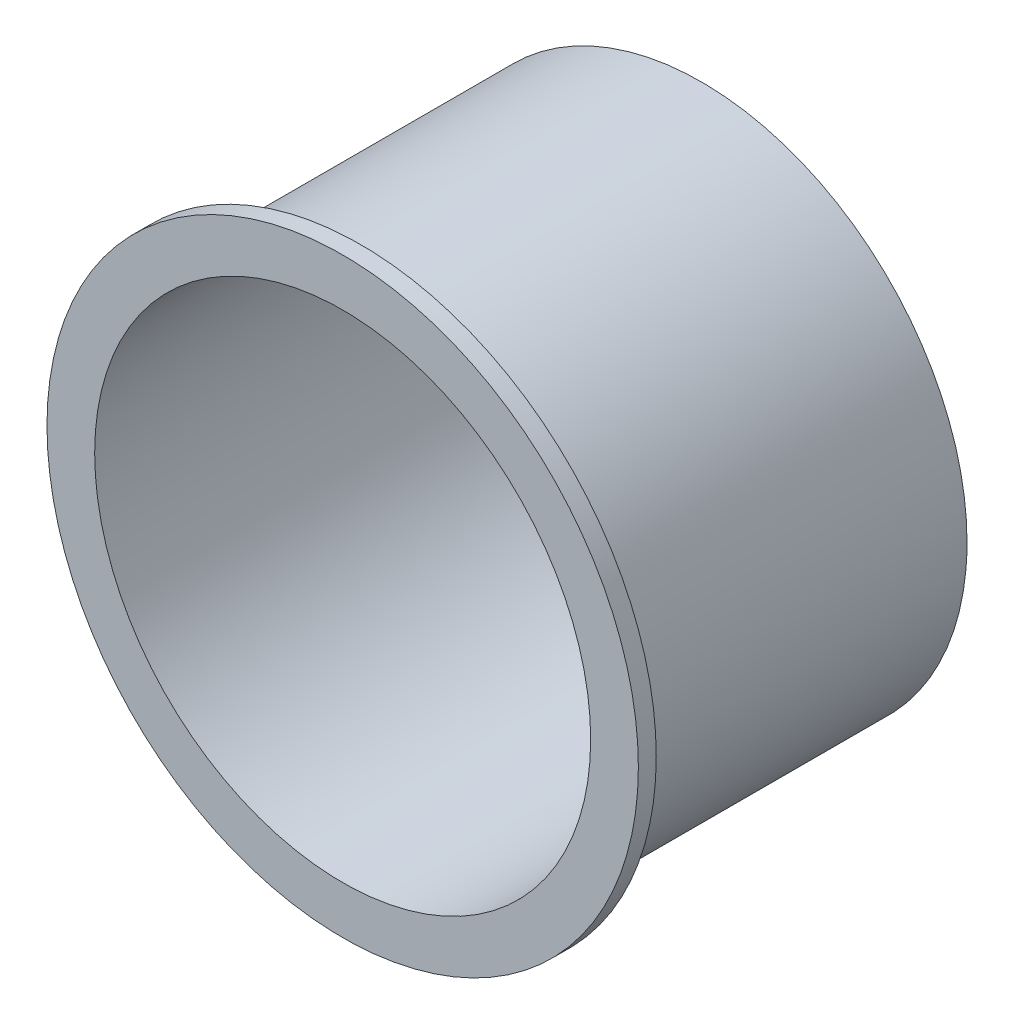
ISO-10303-21;
HEADER;
FILE_DESCRIPTION(('STEP AP214'),'2;1');
FILE_NAME('part.step','',(''),(''),'','','');
FILE_SCHEMA(('AUTOMOTIVE_DESIGN { 1 0 10303 214 1 1 1 1 }'));
ENDSEC;
DATA;
#1=APPLICATION_CONTEXT('core data for automotive mechanical design processes');
#2=APPLICATION_PROTOCOL_DEFINITION('international standard','automotive_design',2000,#1);
#3=PRODUCT_CONTEXT('',#1,'mechanical');
#4=PRODUCT('Part','Part','',(#3));
#5=PRODUCT_RELATED_PRODUCT_CATEGORY('part','',(#4));
#6=PRODUCT_DEFINITION_FORMATION('','',#4);
#7=PRODUCT_DEFINITION_CONTEXT('part definition',#1,'design');
#8=PRODUCT_DEFINITION('design','',#6,#7);
#9=PRODUCT_DEFINITION_SHAPE('','',#8);
#10=(LENGTH_UNIT() NAMED_UNIT(*) SI_UNIT(.MILLI.,.METRE.));
#11=(NAMED_UNIT(*) PLANE_ANGLE_UNIT() SI_UNIT($,.RADIAN.));
#12=(NAMED_UNIT(*) SI_UNIT($,.STERADIAN.) SOLID_ANGLE_UNIT());
#13=UNCERTAINTY_MEASURE_WITH_UNIT(LENGTH_MEASURE(1.E-05),#10,'distance_accuracy_value','');
#14=(GEOMETRIC_REPRESENTATION_CONTEXT(3) GLOBAL_UNCERTAINTY_ASSIGNED_CONTEXT((#13)) GLOBAL_UNIT_ASSIGNED_CONTEXT((#10,
#11,#12)) REPRESENTATION_CONTEXT('',''));
#15=CARTESIAN_POINT('',(0.,0.,0.));
#16=DIRECTION('',(0.,0.,1.));
#17=DIRECTION('',(1.,0.,0.));
#18=AXIS2_PLACEMENT_3D('',#15,#16,#17);
#19=CARTESIAN_POINT('',(0.,0.,-145.47497929707));
#20=DIRECTION('',(0.,0.,1.));
#21=DIRECTION('',(1.,0.,0.));
#22=AXIS2_PLACEMENT_3D('',#19,#20,#21);
#23=CYLINDRICAL_SURFACE('',#22,35.40125);
#24=CARTESIAN_POINT('',(0.,0.,-45.34503252927));
#25=DIRECTION('',(0.,0.00190682555375026,0.999998182006501));
#26=DIRECTION('',(-1.10719888378906E-13,-0.999998182006501,0.00190682555375026));
#27=AXIS2_PLACEMENT_3D('',#24,#25,#26);
#28=ELLIPSE('',#27,35.4013143593594,35.40125);
#29=CARTESIAN_POINT('',(-3.91962957433482E-12,-35.40125,-45.2775283984133));
#30=VERTEX_POINT('',#29);
#31=EDGE_CURVE('E10',#30,#30,#28,.F.);
#32=ORIENTED_EDGE('',*,*,#31,.F.);
#33=EDGE_LOOP('',(#32));
#34=FACE_BOUND('',#33,.T.);
#35=CARTESIAN_POINT('',(0.,0.,0.));
#36=DIRECTION('',(0.,0.,1.));
#37=DIRECTION('',(1.,0.,0.));
#38=AXIS2_PLACEMENT_3D('',#35,#36,#37);
#39=CIRCLE('',#38,35.40125);
#40=CARTESIAN_POINT('',(35.40125,0.,0.));
#41=VERTEX_POINT('',#40);
#42=EDGE_CURVE('E382',#41,#41,#39,.T.);
#43=ORIENTED_EDGE('',*,*,#42,.F.);
#44=EDGE_LOOP('',(#43));
#45=FACE_BOUND('',#44,.T.);
#46=ADVANCED_FACE('F369',(#34,#45),#23,.T.);
#47=CARTESIAN_POINT('',(0.,0.,-145.47497929707));
#48=DIRECTION('',(0.,0.,1.));
#49=DIRECTION('',(1.,0.,0.));
#50=AXIS2_PLACEMENT_3D('',#47,#48,#49);
#51=CYLINDRICAL_SURFACE('',#50,33.02);
#52=CARTESIAN_POINT('',(0.,0.,-45.34503252927));
#53=DIRECTION('',(0.,0.00190682555375026,0.999998182006501));
#54=DIRECTION('',(-1.10719888378906E-13,-0.999998182006501,0.00190682555375026));
#55=AXIS2_PLACEMENT_3D('',#52,#53,#54);
#56=ELLIPSE('',#55,33.0200600302545,33.02);
#57=CARTESIAN_POINT('',(-3.65597736081454E-12,-33.02,-45.282069035018));
#58=VERTEX_POINT('',#57);
#59=EDGE_CURVE('E372',#58,#58,#56,.F.);
#60=ORIENTED_EDGE('',*,*,#59,.T.);
#61=EDGE_LOOP('',(#60));
#62=FACE_BOUND('',#61,.T.);
#63=CARTESIAN_POINT('',(0.,0.,2.38125));
#64=DIRECTION('',(0.,0.,1.));
#65=DIRECTION('',(1.,0.,0.));
#66=AXIS2_PLACEMENT_3D('',#63,#64,#65);
#67=CIRCLE('',#66,33.02);
#68=CARTESIAN_POINT('',(33.02,0.,2.38125));
#69=VERTEX_POINT('',#68);
#70=EDGE_CURVE('E398',#69,#69,#67,.T.);
#71=ORIENTED_EDGE('',*,*,#70,.T.);
#72=EDGE_LOOP('',(#71));
#73=FACE_BOUND('',#72,.T.);
#74=ADVANCED_FACE('F405',(#62,#73),#51,.F.);
#75=CARTESIAN_POINT('',(-45.7956683258275,-47.3326715179087,-45.2547772176089));
#76=DIRECTION('',(0.,0.00190682555375026,0.999998182006501));
#77=DIRECTION('',(1.,0.,0.));
#78=AXIS2_PLACEMENT_3D('',#75,#76,#77);
#79=PLANE('',#78);
#80=ORIENTED_EDGE('',*,*,#31,.T.);
#81=EDGE_LOOP('',(#80));
#82=FACE_BOUND('',#81,.T.);
#83=ORIENTED_EDGE('',*,*,#59,.F.);
#84=EDGE_LOOP('',(#83));
#85=FACE_BOUND('',#84,.T.);
#86=ADVANCED_FACE('F410',(#82,#85),#79,.F.);
#87=CARTESIAN_POINT('',(0.,0.,2.38125));
#88=DIRECTION('',(0.,0.,1.));
#89=DIRECTION('',(1.,0.,0.));
#90=AXIS2_PLACEMENT_3D('',#87,#88,#89);
#91=PLANE('',#90);
#92=CARTESIAN_POINT('',(0.,0.,2.38125));
#93=DIRECTION('',(0.,0.,1.));
#94=DIRECTION('',(1.,0.,0.));
#95=AXIS2_PLACEMENT_3D('',#92,#93,#94);
#96=CIRCLE('',#95,39.37);
#97=CARTESIAN_POINT('',(-39.37,0.,2.38125));
#98=VERTEX_POINT('',#97);
#99=EDGE_CURVE('E384',#98,#98,#96,.T.);
#100=ORIENTED_EDGE('',*,*,#99,.T.);
#101=EDGE_LOOP('',(#100));
#102=FACE_BOUND('',#101,.T.);
#103=ORIENTED_EDGE('',*,*,#70,.F.);
#104=EDGE_LOOP('',(#103));
#105=FACE_BOUND('',#104,.T.);
#106=ADVANCED_FACE('F407',(#102,#105),#91,.T.);
#107=CARTESIAN_POINT('',(0.,0.,0.));
#108=DIRECTION('',(0.,0.,1.));
#109=DIRECTION('',(1.,0.,0.));
#110=AXIS2_PLACEMENT_3D('',#107,#108,#109);
#111=PLANE('',#110);
#112=ORIENTED_EDGE('',*,*,#42,.T.);
#113=EDGE_LOOP('',(#112));
#114=FACE_BOUND('',#113,.T.);
#115=CARTESIAN_POINT('',(0.,0.,0.));
#116=DIRECTION('',(0.,0.,1.));
#117=DIRECTION('',(1.,0.,0.));
#118=AXIS2_PLACEMENT_3D('',#115,#116,#117);
#119=CIRCLE('',#118,39.37);
#120=CARTESIAN_POINT('',(-39.37,0.,0.));
#121=VERTEX_POINT('',#120);
#122=EDGE_CURVE('E393',#121,#121,#119,.T.);
#123=ORIENTED_EDGE('',*,*,#122,.F.);
#124=EDGE_LOOP('',(#123));
#125=FACE_BOUND('',#124,.T.);
#126=ADVANCED_FACE('F409',(#114,#125),#111,.F.);
#127=CARTESIAN_POINT('',(0.,0.,2.38125));
#128=DIRECTION('',(0.,0.,-1.));
#129=DIRECTION('',(-1.,0.,0.));
#130=AXIS2_PLACEMENT_3D('',#127,#128,#129);
#131=CYLINDRICAL_SURFACE('',#130,39.37);
#132=CARTESIAN_POINT('',(-39.37,0.,2.38125));
#133=CARTESIAN_POINT('',(-39.37,0.,2.3564453125));
#134=CARTESIAN_POINT('',(-39.37,0.,2.331640625));
#135=CARTESIAN_POINT('',(-39.37,0.,2.28203125));
#136=CARTESIAN_POINT('',(-39.37,0.,2.2572265625));
#137=CARTESIAN_POINT('',(-39.37,0.,2.2076171875));
#138=CARTESIAN_POINT('',(-39.37,0.,2.1828125));
#139=CARTESIAN_POINT('',(-39.37,0.,2.133203125));
#140=CARTESIAN_POINT('',(-39.37,0.,2.1083984375));
#141=CARTESIAN_POINT('',(-39.37,0.,2.0587890625));
#142=CARTESIAN_POINT('',(-39.37,0.,2.033984375));
#143=CARTESIAN_POINT('',(-39.37,0.,1.984375));
#144=CARTESIAN_POINT('',(-39.37,0.,1.9595703125));
#145=CARTESIAN_POINT('',(-39.37,0.,1.9099609375));
#146=CARTESIAN_POINT('',(-39.37,0.,1.88515625));
#147=CARTESIAN_POINT('',(-39.37,0.,1.835546875));
#148=CARTESIAN_POINT('',(-39.37,0.,1.8107421875));
#149=CARTESIAN_POINT('',(-39.37,0.,1.7611328125));
#150=CARTESIAN_POINT('',(-39.37,0.,1.736328125));
#151=CARTESIAN_POINT('',(-39.37,0.,1.68671875));
#152=CARTESIAN_POINT('',(-39.37,0.,1.6619140625));
#153=CARTESIAN_POINT('',(-39.37,0.,1.6123046875));
#154=CARTESIAN_POINT('',(-39.37,0.,1.5875));
#155=CARTESIAN_POINT('',(-39.37,0.,1.537890625));
#156=CARTESIAN_POINT('',(-39.37,0.,1.5130859375));
#157=CARTESIAN_POINT('',(-39.37,0.,1.4634765625));
#158=CARTESIAN_POINT('',(-39.37,0.,1.438671875));
#159=CARTESIAN_POINT('',(-39.37,0.,1.3890625));
#160=CARTESIAN_POINT('',(-39.37,0.,1.3642578125));
#161=CARTESIAN_POINT('',(-39.37,0.,1.3146484375));
#162=CARTESIAN_POINT('',(-39.37,0.,1.28984375));
#163=CARTESIAN_POINT('',(-39.37,0.,1.240234375));
#164=CARTESIAN_POINT('',(-39.37,0.,1.2154296875));
#165=CARTESIAN_POINT('',(-39.37,0.,1.1658203125));
#166=CARTESIAN_POINT('',(-39.37,0.,1.141015625));
#167=CARTESIAN_POINT('',(-39.37,0.,1.09140625));
#168=CARTESIAN_POINT('',(-39.37,0.,1.0666015625));
#169=CARTESIAN_POINT('',(-39.37,0.,1.0169921875));
#170=CARTESIAN_POINT('',(-39.37,0.,0.9921875));
#171=CARTESIAN_POINT('',(-39.37,0.,0.942578125));
#172=CARTESIAN_POINT('',(-39.37,0.,0.9177734375));
#173=CARTESIAN_POINT('',(-39.37,0.,0.8681640625));
#174=CARTESIAN_POINT('',(-39.37,0.,0.843359375));
#175=CARTESIAN_POINT('',(-39.37,0.,0.79375));
#176=CARTESIAN_POINT('',(-39.37,0.,0.7689453125));
#177=CARTESIAN_POINT('',(-39.37,0.,0.7193359375));
#178=CARTESIAN_POINT('',(-39.37,0.,0.69453125));
#179=CARTESIAN_POINT('',(-39.37,0.,0.644921875));
#180=CARTESIAN_POINT('',(-39.37,0.,0.6201171875));
#181=CARTESIAN_POINT('',(-39.37,0.,0.5705078125));
#182=CARTESIAN_POINT('',(-39.37,0.,0.545703125));
#183=CARTESIAN_POINT('',(-39.37,0.,0.49609375));
#184=CARTESIAN_POINT('',(-39.37,0.,0.4712890625));
#185=CARTESIAN_POINT('',(-39.37,0.,0.4216796875));
#186=CARTESIAN_POINT('',(-39.37,0.,0.396875));
#187=CARTESIAN_POINT('',(-39.37,0.,0.347265625));
#188=CARTESIAN_POINT('',(-39.37,0.,0.3224609375));
#189=CARTESIAN_POINT('',(-39.37,0.,0.2728515625));
#190=CARTESIAN_POINT('',(-39.37,0.,0.248046875));
#191=CARTESIAN_POINT('',(-39.37,0.,0.1984375));
#192=CARTESIAN_POINT('',(-39.37,0.,0.1736328125));
#193=CARTESIAN_POINT('',(-39.37,0.,0.1240234375));
#194=CARTESIAN_POINT('',(-39.37,0.,0.0992187500000001));
#195=CARTESIAN_POINT('',(-39.37,0.,0.049609375));
#196=CARTESIAN_POINT('',(-39.37,0.,0.0248046875));
#197=CARTESIAN_POINT('',(-39.37,0.,0.));
#198=B_SPLINE_CURVE_WITH_KNOTS('',3,(#132,#133,#134,#135,#136,#137,#138,#139,#140,#141,#142,
#143,#144,#145,#146,#147,#148,#149,#150,#151,#152,#153,#154,#155,#156,#157,#158,#159,#160,#161,
#162,#163,#164,#165,#166,#167,#168,#169,#170,#171,#172,#173,#174,#175,#176,#177,#178,#179,#180,
#181,#182,#183,#184,#185,#186,#187,#188,#189,#190,#191,#192,#193,#194,#195,#196,#197),
.UNSPECIFIED.,.F.,.F.,(4,2,2,2,2,2,2,2,2,2,2,2,2,2,2,2,2,2,2,2,2,2,2,2,2,2,2,2,2,2,2,2,4),(0.,
0.0744140625,0.148828125,0.2232421875,0.29765625,0.3720703125,0.446484375,0.5208984375,
0.5953125,0.6697265625,0.744140625,0.8185546875,0.89296875,0.9673828125,1.041796875,
1.1162109375,1.190625,1.2650390625,1.339453125,1.4138671875,1.48828125,1.5626953125,1.637109375,
1.7115234375,1.7859375,1.8603515625,1.934765625,2.0091796875,2.08359375,2.1580078125,
2.232421875,2.3068359375,2.38125),.UNSPECIFIED.);
#199=EDGE_CURVE('BSEAM415',#98,#121,#198,.T.);
#200=ORIENTED_EDGE('',*,*,#99,.F.);
#201=ORIENTED_EDGE('',*,*,#122,.T.);
#202=ORIENTED_EDGE('',*,*,#199,.T.);
#203=ORIENTED_EDGE('',*,*,#199,.F.);
#204=EDGE_LOOP('',(#200,#202,#201,#203));
#205=FACE_BOUND('',#204,.T.);
#206=ADVANCED_FACE('F415',(#205),#131,.T.);
#207=CLOSED_SHELL('',(#46,#74,#86,#106,#126,#206));
#208=MANIFOLD_SOLID_BREP('B2',#207);
#209=ADVANCED_BREP_SHAPE_REPRESENTATION('',(#18,#208),#14);
#210=SHAPE_DEFINITION_REPRESENTATION(#9,#209);
ENDSEC;
END-ISO-10303-21;
